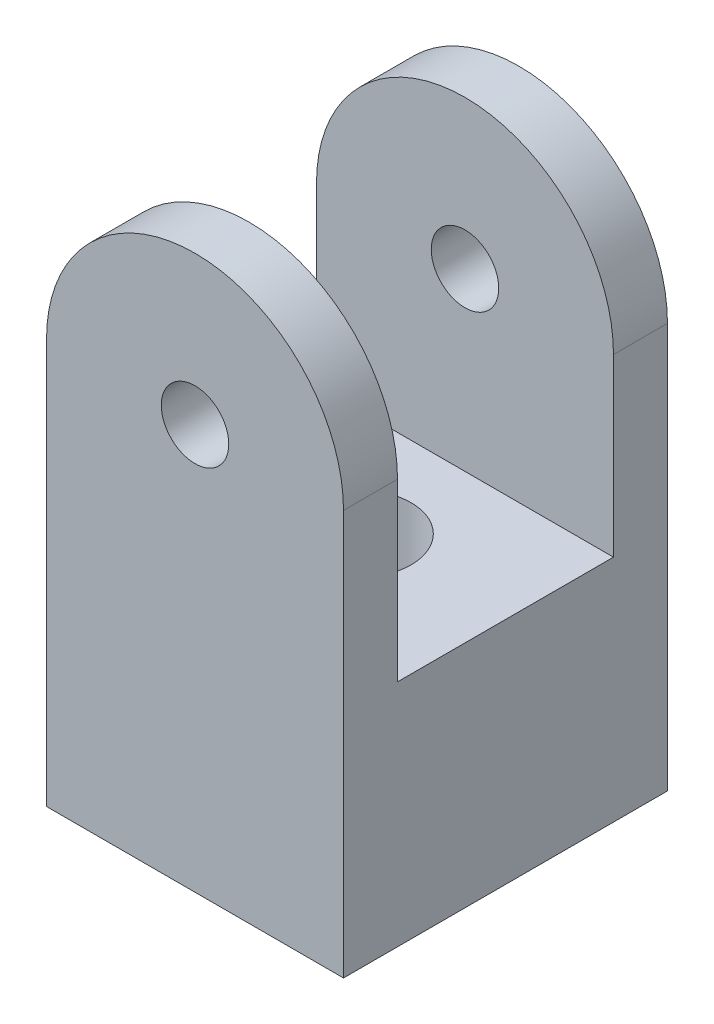
ISO-10303-21;
HEADER;
FILE_DESCRIPTION(('STEP AP214'),'2;1');
FILE_NAME('part.step','',(''),(''),'','','');
FILE_SCHEMA(('AUTOMOTIVE_DESIGN { 1 0 10303 214 1 1 1 1 }'));
ENDSEC;
DATA;
#1=APPLICATION_CONTEXT('core data for automotive mechanical design processes');
#2=APPLICATION_PROTOCOL_DEFINITION('international standard','automotive_design',2000,#1);
#3=PRODUCT_CONTEXT('',#1,'mechanical');
#4=PRODUCT('Part','Part','',(#3));
#5=PRODUCT_RELATED_PRODUCT_CATEGORY('part','',(#4));
#6=PRODUCT_DEFINITION_FORMATION('','',#4);
#7=PRODUCT_DEFINITION_CONTEXT('part definition',#1,'design');
#8=PRODUCT_DEFINITION('design','',#6,#7);
#9=PRODUCT_DEFINITION_SHAPE('','',#8);
#10=(LENGTH_UNIT() NAMED_UNIT(*) SI_UNIT(.MILLI.,.METRE.));
#11=(NAMED_UNIT(*) PLANE_ANGLE_UNIT() SI_UNIT($,.RADIAN.));
#12=(NAMED_UNIT(*) SI_UNIT($,.STERADIAN.) SOLID_ANGLE_UNIT());
#13=UNCERTAINTY_MEASURE_WITH_UNIT(LENGTH_MEASURE(1.E-05),#10,'distance_accuracy_value','');
#14=(GEOMETRIC_REPRESENTATION_CONTEXT(3) GLOBAL_UNCERTAINTY_ASSIGNED_CONTEXT((#13)) GLOBAL_UNIT_ASSIGNED_CONTEXT((#10,
#11,#12)) REPRESENTATION_CONTEXT('',''));
#15=CARTESIAN_POINT('',(0.,0.,0.));
#16=DIRECTION('',(0.,0.,1.));
#17=DIRECTION('',(1.,0.,0.));
#18=AXIS2_PLACEMENT_3D('',#15,#16,#17);
#19=CARTESIAN_POINT('',(0.,30.,-12.));
#20=DIRECTION('',(0.,0.,1.));
#21=DIRECTION('',(1.,0.,0.));
#22=AXIS2_PLACEMENT_3D('',#19,#20,#21);
#23=CYLINDRICAL_SURFACE('',#22,11.);
#24=CARTESIAN_POINT('',(0.,30.,8.));
#25=DIRECTION('',(0.,0.,1.));
#26=DIRECTION('',(1.,0.,0.));
#27=AXIS2_PLACEMENT_3D('',#24,#25,#26);
#28=CIRCLE('',#27,11.);
#29=CARTESIAN_POINT('',(-11.,30.,8.));
#30=VERTEX_POINT('',#29);
#31=CARTESIAN_POINT('',(11.,30.,8.));
#32=VERTEX_POINT('',#31);
#33=EDGE_CURVE('E43',#30,#32,#28,.F.);
#34=ORIENTED_EDGE('',*,*,#33,.F.);
#35=DIRECTION('',(0.,0.,1.));
#36=VECTOR('',#35,1.);
#37=CARTESIAN_POINT('',(-11.,30.,12.));
#38=LINE('',#37,#36);
#39=CARTESIAN_POINT('',(-11.,30.,12.));
#40=VERTEX_POINT('',#39);
#41=EDGE_CURVE('E59',#30,#40,#38,.T.);
#42=ORIENTED_EDGE('',*,*,#41,.T.);
#43=CARTESIAN_POINT('',(0.,30.,12.));
#44=DIRECTION('',(0.,0.,1.));
#45=DIRECTION('',(1.,0.,0.));
#46=AXIS2_PLACEMENT_3D('',#43,#44,#45);
#47=CIRCLE('',#46,11.);
#48=CARTESIAN_POINT('',(11.,30.,12.));
#49=VERTEX_POINT('',#48);
#50=EDGE_CURVE('E140',#49,#40,#47,.T.);
#51=ORIENTED_EDGE('',*,*,#50,.F.);
#52=DIRECTION('',(0.,0.,-1.));
#53=VECTOR('',#52,1.);
#54=CARTESIAN_POINT('',(11.,30.,12.));
#55=LINE('',#54,#53);
#56=EDGE_CURVE('E146',#49,#32,#55,.T.);
#57=ORIENTED_EDGE('',*,*,#56,.T.);
#58=EDGE_LOOP('',(#34,#42,#51,#57));
#59=FACE_BOUND('',#58,.T.);
#60=ADVANCED_FACE('F34',(#59),#23,.T.);
#61=CARTESIAN_POINT('',(11.,30.,12.));
#62=DIRECTION('',(-1.,0.,0.));
#63=DIRECTION('',(0.,0.,1.));
#64=AXIS2_PLACEMENT_3D('',#61,#62,#63);
#65=PLANE('',#64);
#66=DIRECTION('',(0.,0.,-1.));
#67=VECTOR('',#66,1.);
#68=CARTESIAN_POINT('',(11.,17.,8.));
#69=LINE('',#68,#67);
#70=CARTESIAN_POINT('',(11.,17.,8.));
#71=VERTEX_POINT('',#70);
#72=CARTESIAN_POINT('',(11.,17.,-8.));
#73=VERTEX_POINT('',#72);
#74=EDGE_CURVE('E118',#71,#73,#69,.T.);
#75=ORIENTED_EDGE('',*,*,#74,.F.);
#76=DIRECTION('',(0.,-1.,0.));
#77=VECTOR('',#76,1.);
#78=CARTESIAN_POINT('',(11.,17.,8.));
#79=LINE('',#78,#77);
#80=EDGE_CURVE('E124',#32,#71,#79,.T.);
#81=ORIENTED_EDGE('',*,*,#80,.F.);
#82=ORIENTED_EDGE('',*,*,#56,.F.);
#83=DIRECTION('',(0.,-1.,0.));
#84=VECTOR('',#83,1.);
#85=CARTESIAN_POINT('',(11.,30.,12.));
#86=LINE('',#85,#84);
#87=CARTESIAN_POINT('',(11.,0.,12.));
#88=VERTEX_POINT('',#87);
#89=EDGE_CURVE('E151',#49,#88,#86,.T.);
#90=ORIENTED_EDGE('',*,*,#89,.T.);
#91=DIRECTION('',(0.,0.,-1.));
#92=VECTOR('',#91,1.);
#93=CARTESIAN_POINT('',(11.,0.,12.));
#94=LINE('',#93,#92);
#95=CARTESIAN_POINT('',(11.,0.,-12.));
#96=VERTEX_POINT('',#95);
#97=EDGE_CURVE('E143',#88,#96,#94,.T.);
#98=ORIENTED_EDGE('',*,*,#97,.T.);
#99=DIRECTION('',(0.,-1.,0.));
#100=VECTOR('',#99,1.);
#101=CARTESIAN_POINT('',(11.,30.,-12.));
#102=LINE('',#101,#100);
#103=CARTESIAN_POINT('',(11.,30.,-12.));
#104=VERTEX_POINT('',#103);
#105=EDGE_CURVE('E165',#104,#96,#102,.T.);
#106=ORIENTED_EDGE('',*,*,#105,.F.);
#107=CARTESIAN_POINT('',(11.,30.,-8.));
#108=VERTEX_POINT('',#107);
#109=EDGE_CURVE('E87',#108,#104,#55,.T.);
#110=ORIENTED_EDGE('',*,*,#109,.F.);
#111=DIRECTION('',(0.,1.,0.));
#112=VECTOR('',#111,1.);
#113=CARTESIAN_POINT('',(11.,44.5518541134174,-8.));
#114=LINE('',#113,#112);
#115=EDGE_CURVE('E50',#73,#108,#114,.T.);
#116=ORIENTED_EDGE('',*,*,#115,.F.);
#117=EDGE_LOOP('',(#75,#81,#82,#90,#98,#106,#110,#116));
#118=FACE_BOUND('',#117,.T.);
#119=ADVANCED_FACE('F36',(#118),#65,.F.);
#120=CARTESIAN_POINT('',(-11.,30.,-12.));
#121=DIRECTION('',(0.,0.,1.));
#122=DIRECTION('',(1.,0.,0.));
#123=AXIS2_PLACEMENT_3D('',#120,#121,#122);
#124=PLANE('',#123);
#125=CARTESIAN_POINT('',(0.,30.,-12.));
#126=DIRECTION('',(0.,0.,1.));
#127=DIRECTION('',(1.,0.,0.));
#128=AXIS2_PLACEMENT_3D('',#125,#126,#127);
#129=CIRCLE('',#128,2.5);
#130=CARTESIAN_POINT('',(2.50000000000001,30.,-12.));
#131=VERTEX_POINT('',#130);
#132=EDGE_CURVE('E212',#131,#131,#129,.T.);
#133=ORIENTED_EDGE('',*,*,#132,.T.);
#134=EDGE_LOOP('',(#133));
#135=FACE_BOUND('',#134,.T.);
#136=DIRECTION('',(-1.,0.,0.));
#137=VECTOR('',#136,1.);
#138=CARTESIAN_POINT('',(-11.,0.,-12.));
#139=LINE('',#138,#137);
#140=CARTESIAN_POINT('',(-11.,0.,-12.));
#141=VERTEX_POINT('',#140);
#142=EDGE_CURVE('E154',#96,#141,#139,.T.);
#143=ORIENTED_EDGE('',*,*,#142,.T.);
#144=DIRECTION('',(0.,-1.,0.));
#145=VECTOR('',#144,1.);
#146=CARTESIAN_POINT('',(-11.,30.,-12.));
#147=LINE('',#146,#145);
#148=CARTESIAN_POINT('',(-11.,30.,-12.));
#149=VERTEX_POINT('',#148);
#150=EDGE_CURVE('E162',#149,#141,#147,.T.);
#151=ORIENTED_EDGE('',*,*,#150,.F.);
#152=CARTESIAN_POINT('',(0.,30.,-12.));
#153=DIRECTION('',(0.,0.,1.));
#154=DIRECTION('',(1.,0.,0.));
#155=AXIS2_PLACEMENT_3D('',#152,#153,#154);
#156=CIRCLE('',#155,11.);
#157=EDGE_CURVE('E141',#104,#149,#156,.T.);
#158=ORIENTED_EDGE('',*,*,#157,.F.);
#159=ORIENTED_EDGE('',*,*,#105,.T.);
#160=EDGE_LOOP('',(#143,#151,#158,#159));
#161=FACE_BOUND('',#160,.T.);
#162=ADVANCED_FACE('F177',(#135,#161),#124,.F.);
#163=CARTESIAN_POINT('',(-11.,30.,12.));
#164=DIRECTION('',(1.,0.,0.));
#165=DIRECTION('',(0.,0.,-1.));
#166=AXIS2_PLACEMENT_3D('',#163,#164,#165);
#167=PLANE('',#166);
#168=ORIENTED_EDGE('',*,*,#41,.F.);
#169=DIRECTION('',(0.,-1.,0.));
#170=VECTOR('',#169,1.);
#171=CARTESIAN_POINT('',(-11.,30.,8.));
#172=LINE('',#171,#170);
#173=CARTESIAN_POINT('',(-11.,17.,8.));
#174=VERTEX_POINT('',#173);
#175=EDGE_CURVE('E138',#30,#174,#172,.T.);
#176=ORIENTED_EDGE('',*,*,#175,.T.);
#177=DIRECTION('',(0.,0.,-1.));
#178=VECTOR('',#177,1.);
#179=CARTESIAN_POINT('',(-11.,17.,12.));
#180=LINE('',#179,#178);
#181=CARTESIAN_POINT('',(-11.,17.,-8.));
#182=VERTEX_POINT('',#181);
#183=EDGE_CURVE('E11',#174,#182,#180,.T.);
#184=ORIENTED_EDGE('',*,*,#183,.T.);
#185=DIRECTION('',(0.,1.,0.));
#186=VECTOR('',#185,1.);
#187=CARTESIAN_POINT('',(-11.,30.,-8.));
#188=LINE('',#187,#186);
#189=CARTESIAN_POINT('',(-11.,30.,-8.));
#190=VERTEX_POINT('',#189);
#191=EDGE_CURVE('E134',#182,#190,#188,.T.);
#192=ORIENTED_EDGE('',*,*,#191,.T.);
#193=EDGE_CURVE('E148',#149,#190,#38,.T.);
#194=ORIENTED_EDGE('',*,*,#193,.F.);
#195=ORIENTED_EDGE('',*,*,#150,.T.);
#196=DIRECTION('',(0.,0.,1.));
#197=VECTOR('',#196,1.);
#198=CARTESIAN_POINT('',(-11.,0.,12.));
#199=LINE('',#198,#197);
#200=CARTESIAN_POINT('',(-11.,0.,12.));
#201=VERTEX_POINT('',#200);
#202=EDGE_CURVE('E156',#141,#201,#199,.T.);
#203=ORIENTED_EDGE('',*,*,#202,.T.);
#204=DIRECTION('',(0.,-1.,0.));
#205=VECTOR('',#204,1.);
#206=CARTESIAN_POINT('',(-11.,30.,12.));
#207=LINE('',#206,#205);
#208=EDGE_CURVE('E160',#40,#201,#207,.T.);
#209=ORIENTED_EDGE('',*,*,#208,.F.);
#210=EDGE_LOOP('',(#168,#176,#184,#192,#194,#195,#203,#209));
#211=FACE_BOUND('',#210,.T.);
#212=ADVANCED_FACE('F173',(#211),#167,.F.);
#213=CARTESIAN_POINT('',(-11.,30.,12.));
#214=DIRECTION('',(0.,0.,-1.));
#215=DIRECTION('',(-1.,0.,0.));
#216=AXIS2_PLACEMENT_3D('',#213,#214,#215);
#217=PLANE('',#216);
#218=CARTESIAN_POINT('',(0.,30.,12.));
#219=DIRECTION('',(0.,0.,1.));
#220=DIRECTION('',(1.,0.,0.));
#221=AXIS2_PLACEMENT_3D('',#218,#219,#220);
#222=CIRCLE('',#221,2.5);
#223=CARTESIAN_POINT('',(2.50000000000001,30.,12.));
#224=VERTEX_POINT('',#223);
#225=EDGE_CURVE('E214',#224,#224,#222,.T.);
#226=ORIENTED_EDGE('',*,*,#225,.F.);
#227=EDGE_LOOP('',(#226));
#228=FACE_BOUND('',#227,.T.);
#229=DIRECTION('',(1.,0.,0.));
#230=VECTOR('',#229,1.);
#231=CARTESIAN_POINT('',(-11.,0.,12.));
#232=LINE('',#231,#230);
#233=EDGE_CURVE('E81',#201,#88,#232,.T.);
#234=ORIENTED_EDGE('',*,*,#233,.T.);
#235=ORIENTED_EDGE('',*,*,#89,.F.);
#236=ORIENTED_EDGE('',*,*,#50,.T.);
#237=ORIENTED_EDGE('',*,*,#208,.T.);
#238=EDGE_LOOP('',(#234,#235,#236,#237));
#239=FACE_BOUND('',#238,.T.);
#240=ADVANCED_FACE('F182',(#228,#239),#217,.F.);
#241=CARTESIAN_POINT('',(0.,0.,0.));
#242=DIRECTION('',(0.,-1.,0.));
#243=DIRECTION('',(0.,0.,-1.));
#244=AXIS2_PLACEMENT_3D('',#241,#242,#243);
#245=PLANE('',#244);
#246=CARTESIAN_POINT('',(0.,0.,0.));
#247=DIRECTION('',(0.,-1.,0.));
#248=DIRECTION('',(0.,0.,-1.));
#249=AXIS2_PLACEMENT_3D('',#246,#247,#248);
#250=CIRCLE('',#249,4.);
#251=CARTESIAN_POINT('',(0.,0.,-4.));
#252=VERTEX_POINT('',#251);
#253=EDGE_CURVE('E128',#252,#252,#250,.T.);
#254=ORIENTED_EDGE('',*,*,#253,.F.);
#255=EDGE_LOOP('',(#254));
#256=FACE_BOUND('',#255,.T.);
#257=ORIENTED_EDGE('',*,*,#97,.F.);
#258=ORIENTED_EDGE('',*,*,#233,.F.);
#259=ORIENTED_EDGE('',*,*,#202,.F.);
#260=ORIENTED_EDGE('',*,*,#142,.F.);
#261=EDGE_LOOP('',(#257,#258,#259,#260));
#262=FACE_BOUND('',#261,.T.);
#263=ADVANCED_FACE('F181',(#256,#262),#245,.T.);
#264=CARTESIAN_POINT('',(0.,30.,-8.));
#265=DIRECTION('',(0.,0.,-1.));
#266=DIRECTION('',(-1.,0.,0.));
#267=AXIS2_PLACEMENT_3D('',#264,#265,#266);
#268=CIRCLE('',#267,11.);
#269=EDGE_CURVE('E168',#108,#190,#268,.F.);
#270=ORIENTED_EDGE('',*,*,#269,.F.);
#271=ORIENTED_EDGE('',*,*,#109,.T.);
#272=ORIENTED_EDGE('',*,*,#157,.T.);
#273=ORIENTED_EDGE('',*,*,#193,.T.);
#274=EDGE_LOOP('',(#270,#271,#272,#273));
#275=FACE_BOUND('',#274,.T.);
#276=ADVANCED_FACE('F174',(#275),#23,.T.);
#277=CARTESIAN_POINT('',(-13.,17.,8.));
#278=DIRECTION('',(0.,-1.,0.));
#279=DIRECTION('',(0.,0.,-1.));
#280=AXIS2_PLACEMENT_3D('',#277,#278,#279);
#281=PLANE('',#280);
#282=CARTESIAN_POINT('',(0.,17.,0.));
#283=DIRECTION('',(0.,1.,0.));
#284=DIRECTION('',(0.,0.,1.));
#285=AXIS2_PLACEMENT_3D('',#282,#283,#284);
#286=CIRCLE('',#285,4.);
#287=CARTESIAN_POINT('',(0.,17.,4.));
#288=VERTEX_POINT('',#287);
#289=EDGE_CURVE('E223',#288,#288,#286,.T.);
#290=ORIENTED_EDGE('',*,*,#289,.F.);
#291=EDGE_LOOP('',(#290));
#292=FACE_BOUND('',#291,.T.);
#293=DIRECTION('',(1.,0.,0.));
#294=VECTOR('',#293,1.);
#295=CARTESIAN_POINT('',(-13.,17.,8.));
#296=LINE('',#295,#294);
#297=EDGE_CURVE('E113',#174,#71,#296,.T.);
#298=ORIENTED_EDGE('',*,*,#297,.T.);
#299=ORIENTED_EDGE('',*,*,#74,.T.);
#300=DIRECTION('',(1.,0.,0.));
#301=VECTOR('',#300,1.);
#302=CARTESIAN_POINT('',(-13.,17.,-8.));
#303=LINE('',#302,#301);
#304=EDGE_CURVE('E121',#182,#73,#303,.T.);
#305=ORIENTED_EDGE('',*,*,#304,.F.);
#306=ORIENTED_EDGE('',*,*,#183,.F.);
#307=EDGE_LOOP('',(#298,#299,#305,#306));
#308=FACE_BOUND('',#307,.T.);
#309=ADVANCED_FACE('F115',(#292,#308),#281,.F.);
#310=CARTESIAN_POINT('',(-13.,17.,8.));
#311=DIRECTION('',(0.,0.,1.));
#312=DIRECTION('',(1.,0.,0.));
#313=AXIS2_PLACEMENT_3D('',#310,#311,#312);
#314=PLANE('',#313);
#315=CARTESIAN_POINT('',(0.,30.,8.));
#316=DIRECTION('',(0.,0.,1.));
#317=DIRECTION('',(1.,0.,0.));
#318=AXIS2_PLACEMENT_3D('',#315,#316,#317);
#319=CIRCLE('',#318,2.5);
#320=CARTESIAN_POINT('',(2.50000000000001,30.,8.));
#321=VERTEX_POINT('',#320);
#322=EDGE_CURVE('E217',#321,#321,#319,.T.);
#323=ORIENTED_EDGE('',*,*,#322,.T.);
#324=EDGE_LOOP('',(#323));
#325=FACE_BOUND('',#324,.T.);
#326=ORIENTED_EDGE('',*,*,#33,.T.);
#327=ORIENTED_EDGE('',*,*,#80,.T.);
#328=ORIENTED_EDGE('',*,*,#297,.F.);
#329=ORIENTED_EDGE('',*,*,#175,.F.);
#330=EDGE_LOOP('',(#326,#327,#328,#329));
#331=FACE_BOUND('',#330,.T.);
#332=ADVANCED_FACE('F125',(#325,#331),#314,.F.);
#333=CARTESIAN_POINT('',(-13.,44.5518541134174,-8.));
#334=DIRECTION('',(0.,0.,-1.));
#335=DIRECTION('',(-1.,0.,0.));
#336=AXIS2_PLACEMENT_3D('',#333,#334,#335);
#337=PLANE('',#336);
#338=CARTESIAN_POINT('',(0.,30.,-8.));
#339=DIRECTION('',(0.,0.,-1.));
#340=DIRECTION('',(-1.,0.,0.));
#341=AXIS2_PLACEMENT_3D('',#338,#339,#340);
#342=CIRCLE('',#341,2.5);
#343=CARTESIAN_POINT('',(-2.49999999999999,30.,-8.));
#344=VERTEX_POINT('',#343);
#345=EDGE_CURVE('E38',#344,#344,#342,.T.);
#346=ORIENTED_EDGE('',*,*,#345,.T.);
#347=EDGE_LOOP('',(#346));
#348=FACE_BOUND('',#347,.T.);
#349=ORIENTED_EDGE('',*,*,#304,.T.);
#350=ORIENTED_EDGE('',*,*,#115,.T.);
#351=ORIENTED_EDGE('',*,*,#269,.T.);
#352=ORIENTED_EDGE('',*,*,#191,.F.);
#353=EDGE_LOOP('',(#349,#350,#351,#352));
#354=FACE_BOUND('',#353,.T.);
#355=ADVANCED_FACE('F170',(#348,#354),#337,.F.);
#356=CARTESIAN_POINT('',(0.,-7.,0.));
#357=DIRECTION('',(0.,1.,0.));
#358=DIRECTION('',(0.,0.,1.));
#359=AXIS2_PLACEMENT_3D('',#356,#357,#358);
#360=CYLINDRICAL_SURFACE('',#359,4.);
#361=ORIENTED_EDGE('',*,*,#253,.T.);
#362=EDGE_LOOP('',(#361));
#363=FACE_BOUND('',#362,.T.);
#364=ORIENTED_EDGE('',*,*,#289,.T.);
#365=EDGE_LOOP('',(#364));
#366=FACE_BOUND('',#365,.T.);
#367=ADVANCED_FACE('F227',(#363,#366),#360,.F.);
#368=CARTESIAN_POINT('',(0.,30.,-12.));
#369=DIRECTION('',(0.,0.,1.));
#370=DIRECTION('',(1.,0.,0.));
#371=AXIS2_PLACEMENT_3D('',#368,#369,#370);
#372=CYLINDRICAL_SURFACE('',#371,2.5);
#373=ORIENTED_EDGE('',*,*,#132,.F.);
#374=EDGE_LOOP('',(#373));
#375=FACE_BOUND('',#374,.T.);
#376=ORIENTED_EDGE('',*,*,#345,.F.);
#377=EDGE_LOOP('',(#376));
#378=FACE_BOUND('',#377,.T.);
#379=ADVANCED_FACE('F230',(#375,#378),#372,.F.);
#380=ORIENTED_EDGE('',*,*,#225,.T.);
#381=EDGE_LOOP('',(#380));
#382=FACE_BOUND('',#381,.T.);
#383=ORIENTED_EDGE('',*,*,#322,.F.);
#384=EDGE_LOOP('',(#383));
#385=FACE_BOUND('',#384,.T.);
#386=ADVANCED_FACE('F237',(#382,#385),#372,.F.);
#387=CLOSED_SHELL('',(#60,#119,#162,#212,#240,#263,#276,#309,#332,#355,#367,#379,#386));
#388=MANIFOLD_SOLID_BREP('B2',#387);
#389=ADVANCED_BREP_SHAPE_REPRESENTATION('',(#18,#388),#14);
#390=SHAPE_DEFINITION_REPRESENTATION(#9,#389);
ENDSEC;
END-ISO-10303-21;
